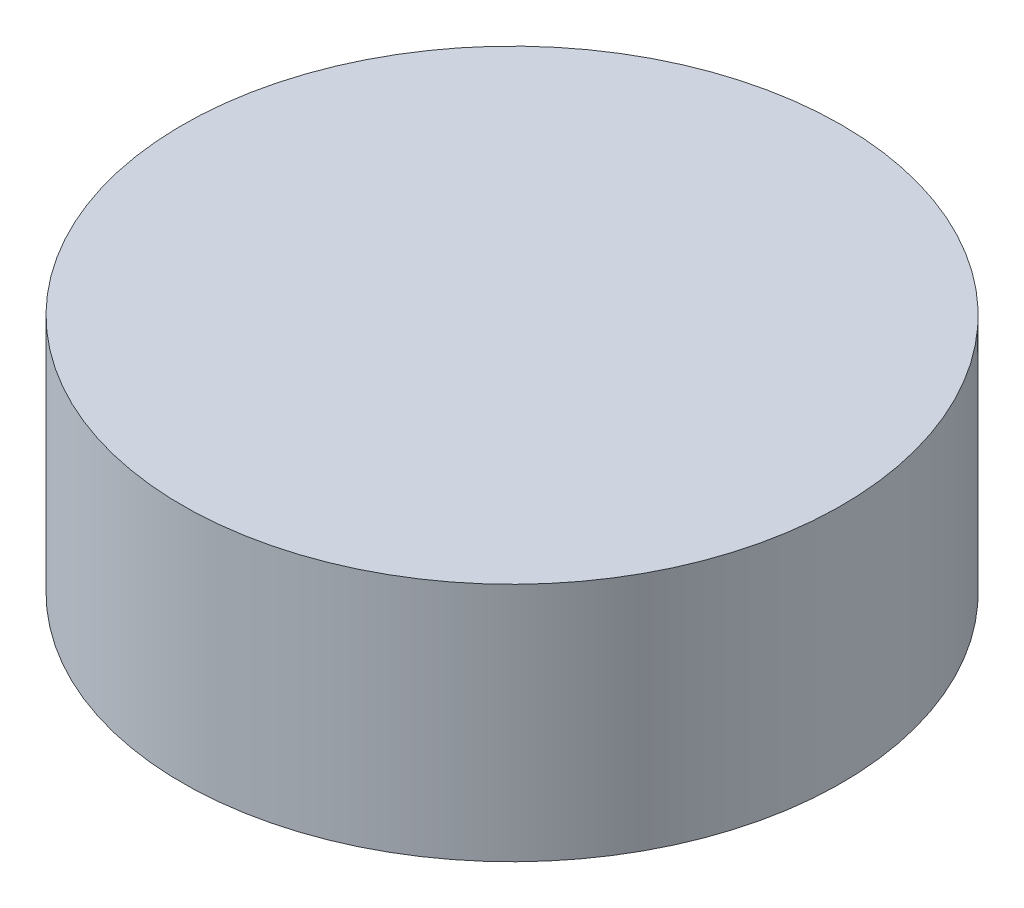
ISO-10303-21;
HEADER;
FILE_DESCRIPTION(('STEP AP214'),'2;1');
FILE_NAME('part.step','',(''),(''),'','','');
FILE_SCHEMA(('AUTOMOTIVE_DESIGN { 1 0 10303 214 1 1 1 1 }'));
ENDSEC;
DATA;
#1=APPLICATION_CONTEXT('core data for automotive mechanical design processes');
#2=APPLICATION_PROTOCOL_DEFINITION('international standard','automotive_design',2000,#1);
#3=PRODUCT_CONTEXT('',#1,'mechanical');
#4=PRODUCT('Part','Part','',(#3));
#5=PRODUCT_RELATED_PRODUCT_CATEGORY('part','',(#4));
#6=PRODUCT_DEFINITION_FORMATION('','',#4);
#7=PRODUCT_DEFINITION_CONTEXT('part definition',#1,'design');
#8=PRODUCT_DEFINITION('design','',#6,#7);
#9=PRODUCT_DEFINITION_SHAPE('','',#8);
#10=(LENGTH_UNIT() NAMED_UNIT(*) SI_UNIT(.MILLI.,.METRE.));
#11=(NAMED_UNIT(*) PLANE_ANGLE_UNIT() SI_UNIT($,.RADIAN.));
#12=(NAMED_UNIT(*) SI_UNIT($,.STERADIAN.) SOLID_ANGLE_UNIT());
#13=UNCERTAINTY_MEASURE_WITH_UNIT(LENGTH_MEASURE(1.E-05),#10,'distance_accuracy_value','');
#14=(GEOMETRIC_REPRESENTATION_CONTEXT(3) GLOBAL_UNCERTAINTY_ASSIGNED_CONTEXT((#13)) GLOBAL_UNIT_ASSIGNED_CONTEXT((#10,
#11,#12)) REPRESENTATION_CONTEXT('',''));
#15=CARTESIAN_POINT('',(0.,0.,0.));
#16=DIRECTION('',(0.,0.,1.));
#17=DIRECTION('',(1.,0.,0.));
#18=AXIS2_PLACEMENT_3D('',#15,#16,#17);
#19=CARTESIAN_POINT('',(-43.,-2.5,0.));
#20=DIRECTION('',(0.,1.,0.));
#21=DIRECTION('',(0.,0.,1.));
#22=AXIS2_PLACEMENT_3D('',#19,#20,#21);
#23=PLANE('',#22);
#24=CARTESIAN_POINT('',(0.,-2.5,0.));
#25=DIRECTION('',(0.,-1.,0.));
#26=DIRECTION('',(0.,0.,-1.));
#27=AXIS2_PLACEMENT_3D('',#24,#25,#26);
#28=CIRCLE('',#27,43.);
#29=CARTESIAN_POINT('',(0.,-2.5,-43.));
#30=VERTEX_POINT('',#29);
#31=EDGE_CURVE('E10',#30,#30,#28,.T.);
#32=ORIENTED_EDGE('',*,*,#31,.T.);
#33=EDGE_LOOP('',(#32));
#34=FACE_BOUND('',#33,.T.);
#35=ADVANCED_FACE('F33',(#34),#23,.F.);
#36=CARTESIAN_POINT('',(0.,-5.50000000000001,0.));
#37=DIRECTION('',(0.,-1.,0.));
#38=DIRECTION('',(0.,0.,-1.));
#39=AXIS2_PLACEMENT_3D('',#36,#37,#38);
#40=TOROIDAL_SURFACE('',#39,43.,3.);
#41=ORIENTED_EDGE('',*,*,#31,.F.);
#42=EDGE_LOOP('',(#41));
#43=FACE_BOUND('',#42,.T.);
#44=CARTESIAN_POINT('',(0.,-5.50000000000001,0.));
#45=DIRECTION('',(0.,-1.,0.));
#46=DIRECTION('',(0.,0.,-1.));
#47=AXIS2_PLACEMENT_3D('',#44,#45,#46);
#48=CIRCLE('',#47,46.);
#49=CARTESIAN_POINT('',(0.,-5.50000000000001,-46.));
#50=VERTEX_POINT('',#49);
#51=EDGE_CURVE('E39',#50,#50,#48,.T.);
#52=ORIENTED_EDGE('',*,*,#51,.T.);
#53=EDGE_LOOP('',(#52));
#54=FACE_BOUND('',#53,.T.);
#55=ADVANCED_FACE('F68',(#43,#54),#40,.F.);
#56=CARTESIAN_POINT('',(0.,0.,0.));
#57=DIRECTION('',(0.,-1.,0.));
#58=DIRECTION('',(0.,0.,-1.));
#59=AXIS2_PLACEMENT_3D('',#56,#57,#58);
#60=CYLINDRICAL_SURFACE('',#59,46.);
#61=ORIENTED_EDGE('',*,*,#51,.F.);
#62=EDGE_LOOP('',(#61));
#63=FACE_BOUND('',#62,.T.);
#64=CARTESIAN_POINT('',(0.,-35.,0.));
#65=DIRECTION('',(0.,-1.,0.));
#66=DIRECTION('',(0.,0.,-1.));
#67=AXIS2_PLACEMENT_3D('',#64,#65,#66);
#68=CIRCLE('',#67,46.);
#69=CARTESIAN_POINT('',(0.,-35.,-46.));
#70=VERTEX_POINT('',#69);
#71=EDGE_CURVE('E43',#70,#70,#68,.T.);
#72=ORIENTED_EDGE('',*,*,#71,.T.);
#73=EDGE_LOOP('',(#72));
#74=FACE_BOUND('',#73,.T.);
#75=ADVANCED_FACE('F72',(#63,#74),#60,.F.);
#76=CARTESIAN_POINT('',(-48.,-35.,0.));
#77=DIRECTION('',(0.,1.,0.));
#78=DIRECTION('',(0.,0.,1.));
#79=AXIS2_PLACEMENT_3D('',#76,#77,#78);
#80=PLANE('',#79);
#81=ORIENTED_EDGE('',*,*,#71,.F.);
#82=EDGE_LOOP('',(#81));
#83=FACE_BOUND('',#82,.T.);
#84=CARTESIAN_POINT('',(0.,-35.,0.));
#85=DIRECTION('',(0.,-1.,0.));
#86=DIRECTION('',(0.,0.,-1.));
#87=AXIS2_PLACEMENT_3D('',#84,#85,#86);
#88=CIRCLE('',#87,48.);
#89=CARTESIAN_POINT('',(0.,-35.,-48.));
#90=VERTEX_POINT('',#89);
#91=EDGE_CURVE('E47',#90,#90,#88,.T.);
#92=ORIENTED_EDGE('',*,*,#91,.T.);
#93=EDGE_LOOP('',(#92));
#94=FACE_BOUND('',#93,.T.);
#95=ADVANCED_FACE('F64',(#83,#94),#80,.F.);
#96=CARTESIAN_POINT('',(0.,0.,0.));
#97=DIRECTION('',(0.,-1.,0.));
#98=DIRECTION('',(0.,0.,-1.));
#99=AXIS2_PLACEMENT_3D('',#96,#97,#98);
#100=CYLINDRICAL_SURFACE('',#99,48.);
#101=ORIENTED_EDGE('',*,*,#91,.F.);
#102=EDGE_LOOP('',(#101));
#103=FACE_BOUND('',#102,.T.);
#104=CARTESIAN_POINT('',(0.,0.,0.));
#105=DIRECTION('',(0.,-1.,0.));
#106=DIRECTION('',(0.,0.,-1.));
#107=AXIS2_PLACEMENT_3D('',#104,#105,#106);
#108=CIRCLE('',#107,48.);
#109=CARTESIAN_POINT('',(0.,0.,-48.));
#110=VERTEX_POINT('',#109);
#111=EDGE_CURVE('E52',#110,#110,#108,.T.);
#112=ORIENTED_EDGE('',*,*,#111,.T.);
#113=EDGE_LOOP('',(#112));
#114=FACE_BOUND('',#113,.T.);
#115=ADVANCED_FACE('F56',(#103,#114),#100,.T.);
#116=CARTESIAN_POINT('',(0.,0.,0.));
#117=DIRECTION('',(0.,-1.,0.));
#118=DIRECTION('',(0.,0.,-1.));
#119=AXIS2_PLACEMENT_3D('',#116,#117,#118);
#120=PLANE('',#119);
#121=ORIENTED_EDGE('',*,*,#111,.F.);
#122=EDGE_LOOP('',(#121));
#123=FACE_BOUND('',#122,.T.);
#124=ADVANCED_FACE('F58',(#123),#120,.F.);
#125=CLOSED_SHELL('',(#35,#55,#75,#95,#115,#124));
#126=MANIFOLD_SOLID_BREP('B2',#125);
#127=ADVANCED_BREP_SHAPE_REPRESENTATION('',(#18,#126),#14);
#128=SHAPE_DEFINITION_REPRESENTATION(#9,#127);
ENDSEC;
END-ISO-10303-21;
